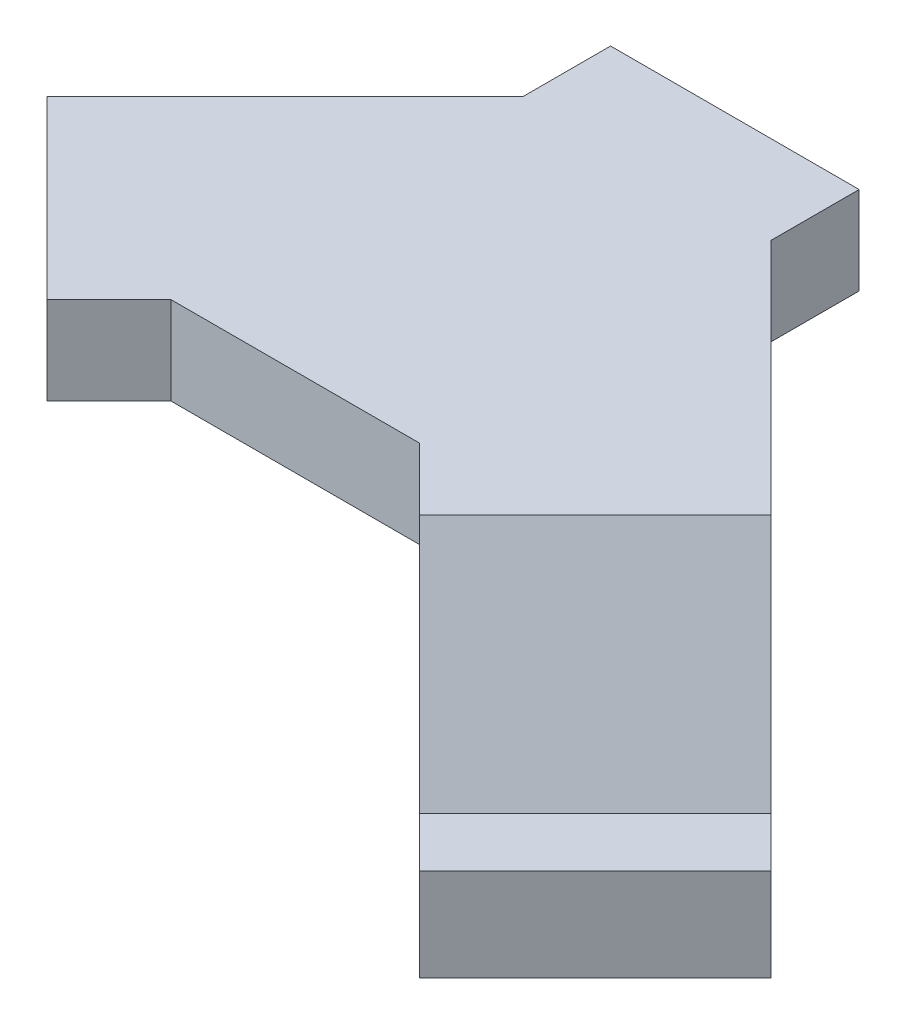
ISO-10303-21;
HEADER;
FILE_DESCRIPTION(('STEP AP214'),'2;1');
FILE_NAME('part.step','',(''),(''),'','','');
FILE_SCHEMA(('AUTOMOTIVE_DESIGN { 1 0 10303 214 1 1 1 1 }'));
ENDSEC;
DATA;
#1=APPLICATION_CONTEXT('core data for automotive mechanical design processes');
#2=APPLICATION_PROTOCOL_DEFINITION('international standard','automotive_design',2000,#1);
#3=PRODUCT_CONTEXT('',#1,'mechanical');
#4=PRODUCT('Part','Part','',(#3));
#5=PRODUCT_RELATED_PRODUCT_CATEGORY('part','',(#4));
#6=PRODUCT_DEFINITION_FORMATION('','',#4);
#7=PRODUCT_DEFINITION_CONTEXT('part definition',#1,'design');
#8=PRODUCT_DEFINITION('design','',#6,#7);
#9=PRODUCT_DEFINITION_SHAPE('','',#8);
#10=(LENGTH_UNIT() NAMED_UNIT(*) SI_UNIT(.MILLI.,.METRE.));
#11=(NAMED_UNIT(*) PLANE_ANGLE_UNIT() SI_UNIT($,.RADIAN.));
#12=(NAMED_UNIT(*) SI_UNIT($,.STERADIAN.) SOLID_ANGLE_UNIT());
#13=UNCERTAINTY_MEASURE_WITH_UNIT(LENGTH_MEASURE(1.E-05),#10,'distance_accuracy_value','');
#14=(GEOMETRIC_REPRESENTATION_CONTEXT(3) GLOBAL_UNCERTAINTY_ASSIGNED_CONTEXT((#13)) GLOBAL_UNIT_ASSIGNED_CONTEXT((#10,
#11,#12)) REPRESENTATION_CONTEXT('',''));
#15=CARTESIAN_POINT('',(0.,0.,0.));
#16=DIRECTION('',(0.,0.,1.));
#17=DIRECTION('',(1.,0.,0.));
#18=AXIS2_PLACEMENT_3D('',#15,#16,#17);
#19=CARTESIAN_POINT('',(-207.023919838023,5.,121.18782091253));
#20=DIRECTION('',(-0.707106781186548,0.,0.707106781186548));
#21=DIRECTION('',(0.707106781186548,0.,0.707106781186548));
#22=AXIS2_PLACEMENT_3D('',#19,#20,#21);
#23=PLANE('',#22);
#24=DIRECTION('',(-0.707106781186547,0.,-0.707106781186547));
#25=VECTOR('',#24,1.);
#26=CARTESIAN_POINT('',(-207.023919838023,0.,121.18782091253));
#27=LINE('',#26,#25);
#28=CARTESIAN_POINT('',(-203.488385932091,0.,124.723354818463));
#29=VERTEX_POINT('',#28);
#30=CARTESIAN_POINT('',(-217.023919838023,0.,111.18782091253));
#31=VERTEX_POINT('',#30);
#32=EDGE_CURVE('E79',#29,#31,#27,.T.);
#33=ORIENTED_EDGE('',*,*,#32,.T.);
#34=DIRECTION('',(0.,-1.,0.));
#35=VECTOR('',#34,1.);
#36=CARTESIAN_POINT('',(-217.023919838023,5.,111.18782091253));
#37=LINE('',#36,#35);
#38=CARTESIAN_POINT('',(-217.023919838023,5.,111.18782091253));
#39=VERTEX_POINT('',#38);
#40=EDGE_CURVE('E11',#39,#31,#37,.T.);
#41=ORIENTED_EDGE('',*,*,#40,.F.);
#42=DIRECTION('',(-0.707106781186547,0.,-0.707106781186547));
#43=VECTOR('',#42,1.);
#44=CARTESIAN_POINT('',(-207.023919838023,5.,121.18782091253));
#45=LINE('',#44,#43);
#46=CARTESIAN_POINT('',(-203.488385932091,5.,124.723354818463));
#47=VERTEX_POINT('',#46);
#48=EDGE_CURVE('E97',#47,#39,#45,.T.);
#49=ORIENTED_EDGE('',*,*,#48,.F.);
#50=DIRECTION('',(0.649640334699754,0.39488589625661,0.649640334699752));
#51=VECTOR('',#50,1.);
#52=CARTESIAN_POINT('',(-203.488385932091,5.,124.723354818463));
#53=LINE('',#52,#51);
#54=CARTESIAN_POINT('',(-160.887880868702,30.8948493872616,167.323859881852));
#55=VERTEX_POINT('',#54);
#56=EDGE_CURVE('E209',#47,#55,#53,.T.);
#57=ORIENTED_EDGE('',*,*,#56,.T.);
#58=DIRECTION('',(0.,1.,0.));
#59=VECTOR('',#58,1.);
#60=CARTESIAN_POINT('',(-160.887880868702,30.8948493872616,167.323859881852));
#61=LINE('',#60,#59);
#62=CARTESIAN_POINT('',(-160.887880868702,32.8948493872616,167.323859881852));
#63=VERTEX_POINT('',#62);
#64=EDGE_CURVE('E206',#55,#63,#61,.T.);
#65=ORIENTED_EDGE('',*,*,#64,.T.);
#66=DIRECTION('',(0.707106781186551,0.,0.707106781186544));
#67=VECTOR('',#66,1.);
#68=CARTESIAN_POINT('',(-160.887880868702,32.8948493872616,167.323859881852));
#69=LINE('',#68,#67);
#70=CARTESIAN_POINT('',(-158.059453743956,32.8948493872616,170.152287006598));
#71=VERTEX_POINT('',#70);
#72=EDGE_CURVE('E203',#63,#71,#69,.T.);
#73=ORIENTED_EDGE('',*,*,#72,.T.);
#74=DIRECTION('',(0.,-1.,0.));
#75=VECTOR('',#74,1.);
#76=CARTESIAN_POINT('',(-158.059453743956,32.8948493872616,170.152287006598));
#77=LINE('',#76,#75);
#78=CARTESIAN_POINT('',(-158.059453743956,27.6141176046023,170.152287006598));
#79=VERTEX_POINT('',#78);
#80=EDGE_CURVE('E200',#71,#79,#77,.T.);
#81=ORIENTED_EDGE('',*,*,#80,.T.);
#82=DIRECTION('',(-0.649640334699754,-0.394885896256609,-0.649640334699752));
#83=VECTOR('',#82,1.);
#84=CARTESIAN_POINT('',(-158.059453743956,27.6141176046023,170.152287006598));
#85=LINE('',#84,#83);
#86=EDGE_CURVE('E197',#79,#29,#85,.T.);
#87=ORIENTED_EDGE('',*,*,#86,.T.);
#88=EDGE_LOOP('',(#33,#41,#49,#57,#65,#73,#81,#87));
#89=FACE_BOUND('',#88,.T.);
#90=ADVANCED_FACE('F41',(#89),#23,.F.);
#91=CARTESIAN_POINT('',(-231.166055461754,5.,111.18782091253));
#92=DIRECTION('',(0.707106781186548,0.,0.707106781186548));
#93=DIRECTION('',(0.707106781186548,0.,-0.707106781186548));
#94=AXIS2_PLACEMENT_3D('',#91,#92,#93);
#95=PLANE('',#94);
#96=DIRECTION('',(-0.707106781186547,0.,0.707106781186547));
#97=VECTOR('',#96,1.);
#98=CARTESIAN_POINT('',(-231.166055461754,0.,111.18782091253));
#99=LINE('',#98,#97);
#100=CARTESIAN_POINT('',(-231.166055461754,0.,111.18782091253));
#101=VERTEX_POINT('',#100);
#102=CARTESIAN_POINT('',(-244.701589367687,0.,124.723354818463));
#103=VERTEX_POINT('',#102);
#104=EDGE_CURVE('E133',#101,#103,#99,.T.);
#105=ORIENTED_EDGE('',*,*,#104,.T.);
#106=DIRECTION('',(0.,1.,0.));
#107=VECTOR('',#106,1.);
#108=CARTESIAN_POINT('',(-244.701589367687,-19.142135623731,124.723354818463));
#109=LINE('',#108,#107);
#110=CARTESIAN_POINT('',(-244.701589367687,5.,124.723354818463));
#111=VERTEX_POINT('',#110);
#112=EDGE_CURVE('E93',#103,#111,#109,.T.);
#113=ORIENTED_EDGE('',*,*,#112,.T.);
#114=DIRECTION('',(-0.707106781186547,0.,0.707106781186547));
#115=VECTOR('',#114,1.);
#116=CARTESIAN_POINT('',(-231.166055461754,5.,111.18782091253));
#117=LINE('',#116,#115);
#118=CARTESIAN_POINT('',(-231.166055461754,5.,111.18782091253));
#119=VERTEX_POINT('',#118);
#120=EDGE_CURVE('E89',#119,#111,#117,.T.);
#121=ORIENTED_EDGE('',*,*,#120,.F.);
#122=DIRECTION('',(0.,-1.,0.));
#123=VECTOR('',#122,1.);
#124=CARTESIAN_POINT('',(-231.166055461754,5.,111.18782091253));
#125=LINE('',#124,#123);
#126=EDGE_CURVE('E49',#119,#101,#125,.T.);
#127=ORIENTED_EDGE('',*,*,#126,.T.);
#128=EDGE_LOOP('',(#105,#113,#121,#127));
#129=FACE_BOUND('',#128,.T.);
#130=ADVANCED_FACE('F90',(#129),#95,.F.);
#131=CARTESIAN_POINT('',(-231.166055461754,5.,131.18782091253));
#132=DIRECTION('',(0.,0.,-1.));
#133=DIRECTION('',(-1.,0.,0.));
#134=AXIS2_PLACEMENT_3D('',#131,#132,#133);
#135=PLANE('',#134);
#136=DIRECTION('',(1.,0.,0.));
#137=VECTOR('',#136,1.);
#138=CARTESIAN_POINT('',(-231.166055461754,0.,131.18782091253));
#139=LINE('',#138,#137);
#140=CARTESIAN_POINT('',(-231.166055461754,0.,131.18782091253));
#141=VERTEX_POINT('',#140);
#142=CARTESIAN_POINT('',(-217.023919838023,0.,131.18782091253));
#143=VERTEX_POINT('',#142);
#144=EDGE_CURVE('E128',#141,#143,#139,.T.);
#145=ORIENTED_EDGE('',*,*,#144,.T.);
#146=DIRECTION('',(0.,-1.,0.));
#147=VECTOR('',#146,1.);
#148=CARTESIAN_POINT('',(-217.023919838023,5.,131.18782091253));
#149=LINE('',#148,#147);
#150=CARTESIAN_POINT('',(-217.023919838023,5.,131.18782091253));
#151=VERTEX_POINT('',#150);
#152=EDGE_CURVE('E131',#151,#143,#149,.T.);
#153=ORIENTED_EDGE('',*,*,#152,.F.);
#154=DIRECTION('',(1.,0.,0.));
#155=VECTOR('',#154,1.);
#156=CARTESIAN_POINT('',(-231.166055461754,5.,131.18782091253));
#157=LINE('',#156,#155);
#158=CARTESIAN_POINT('',(-231.166055461754,5.,131.18782091253));
#159=VERTEX_POINT('',#158);
#160=EDGE_CURVE('E57',#159,#151,#157,.T.);
#161=ORIENTED_EDGE('',*,*,#160,.F.);
#162=DIRECTION('',(0.,-1.,0.));
#163=VECTOR('',#162,1.);
#164=CARTESIAN_POINT('',(-231.166055461754,5.,131.18782091253));
#165=LINE('',#164,#163);
#166=EDGE_CURVE('E109',#159,#141,#165,.T.);
#167=ORIENTED_EDGE('',*,*,#166,.T.);
#168=EDGE_LOOP('',(#145,#153,#161,#167));
#169=FACE_BOUND('',#168,.T.);
#170=ADVANCED_FACE('F143',(#169),#135,.F.);
#171=CARTESIAN_POINT('',(0.,5.,0.));
#172=DIRECTION('',(0.,1.,0.));
#173=DIRECTION('',(0.,0.,1.));
#174=AXIS2_PLACEMENT_3D('',#171,#172,#173);
#175=PLANE('',#174);
#176=ORIENTED_EDGE('',*,*,#160,.T.);
#177=DIRECTION('',(0.707106781186547,0.,0.707106781186547));
#178=VECTOR('',#177,1.);
#179=CARTESIAN_POINT('',(-217.023919838023,5.,131.18782091253));
#180=LINE('',#179,#178);
#181=CARTESIAN_POINT('',(-213.488385932091,5.,134.723354818463));
#182=VERTEX_POINT('',#181);
#183=EDGE_CURVE('E161',#151,#182,#180,.T.);
#184=ORIENTED_EDGE('',*,*,#183,.T.);
#185=DIRECTION('',(0.707106781186549,0.,-0.707106781186547));
#186=VECTOR('',#185,1.);
#187=CARTESIAN_POINT('',(-213.488385932091,5.,134.723354818463));
#188=LINE('',#187,#186);
#189=EDGE_CURVE('E164',#182,#47,#188,.T.);
#190=ORIENTED_EDGE('',*,*,#189,.T.);
#191=ORIENTED_EDGE('',*,*,#48,.T.);
#192=DIRECTION('',(0.,0.,-1.));
#193=VECTOR('',#192,1.);
#194=CARTESIAN_POINT('',(-217.023919838023,5.,106.18782091253));
#195=LINE('',#194,#193);
#196=CARTESIAN_POINT('',(-217.023919838023,5.,106.18782091253));
#197=VERTEX_POINT('',#196);
#198=EDGE_CURVE('E119',#39,#197,#195,.T.);
#199=ORIENTED_EDGE('',*,*,#198,.T.);
#200=DIRECTION('',(-1.,0.,0.));
#201=VECTOR('',#200,1.);
#202=CARTESIAN_POINT('',(-231.166055461754,5.,106.18782091253));
#203=LINE('',#202,#201);
#204=CARTESIAN_POINT('',(-231.166055461754,5.,106.18782091253));
#205=VERTEX_POINT('',#204);
#206=EDGE_CURVE('E113',#197,#205,#203,.T.);
#207=ORIENTED_EDGE('',*,*,#206,.T.);
#208=DIRECTION('',(0.,0.,1.));
#209=VECTOR('',#208,1.);
#210=CARTESIAN_POINT('',(-231.166055461754,5.,106.18782091253));
#211=LINE('',#210,#209);
#212=EDGE_CURVE('E105',#205,#119,#211,.T.);
#213=ORIENTED_EDGE('',*,*,#212,.T.);
#214=ORIENTED_EDGE('',*,*,#120,.T.);
#215=DIRECTION('',(0.707106781186547,0.,0.707106781186547));
#216=VECTOR('',#215,1.);
#217=CARTESIAN_POINT('',(-234.701589367687,5.,134.723354818463));
#218=LINE('',#217,#216);
#219=CARTESIAN_POINT('',(-234.701589367687,5.,134.723354818463));
#220=VERTEX_POINT('',#219);
#221=EDGE_CURVE('E173',#111,#220,#218,.T.);
#222=ORIENTED_EDGE('',*,*,#221,.T.);
#223=DIRECTION('',(0.707106781186545,0.,-0.70710678118655));
#224=VECTOR('',#223,1.);
#225=CARTESIAN_POINT('',(-231.166055461754,5.,131.18782091253));
#226=LINE('',#225,#224);
#227=EDGE_CURVE('E167',#220,#159,#226,.T.);
#228=ORIENTED_EDGE('',*,*,#227,.T.);
#229=EDGE_LOOP('',(#176,#184,#190,#191,#199,#207,#213,#214,#222,#228));
#230=FACE_BOUND('',#229,.T.);
#231=ADVANCED_FACE('F110',(#230),#175,.T.);
#232=CARTESIAN_POINT('',(0.,0.,0.));
#233=DIRECTION('',(0.,1.,0.));
#234=DIRECTION('',(0.,0.,1.));
#235=AXIS2_PLACEMENT_3D('',#232,#233,#234);
#236=PLANE('',#235);
#237=ORIENTED_EDGE('',*,*,#32,.F.);
#238=DIRECTION('',(-0.707106781186549,0.,0.707106781186547));
#239=VECTOR('',#238,1.);
#240=CARTESIAN_POINT('',(-213.488385932091,0.,134.723354818463));
#241=LINE('',#240,#239);
#242=CARTESIAN_POINT('',(-213.488385932091,0.,134.723354818463));
#243=VERTEX_POINT('',#242);
#244=EDGE_CURVE('E178',#29,#243,#241,.T.);
#245=ORIENTED_EDGE('',*,*,#244,.T.);
#246=DIRECTION('',(-0.707106781186548,0.,-0.707106781186548));
#247=VECTOR('',#246,1.);
#248=CARTESIAN_POINT('',(-217.023919838023,0.,131.18782091253));
#249=LINE('',#248,#247);
#250=EDGE_CURVE('E177',#243,#143,#249,.T.);
#251=ORIENTED_EDGE('',*,*,#250,.T.);
#252=ORIENTED_EDGE('',*,*,#144,.F.);
#253=DIRECTION('',(-0.707106781186545,0.,0.70710678118655));
#254=VECTOR('',#253,1.);
#255=CARTESIAN_POINT('',(-231.166055461754,0.,131.18782091253));
#256=LINE('',#255,#254);
#257=CARTESIAN_POINT('',(-234.701589367687,0.,134.723354818463));
#258=VERTEX_POINT('',#257);
#259=EDGE_CURVE('E153',#141,#258,#256,.T.);
#260=ORIENTED_EDGE('',*,*,#259,.T.);
#261=DIRECTION('',(-0.707106781186548,0.,-0.707106781186548));
#262=VECTOR('',#261,1.);
#263=CARTESIAN_POINT('',(-234.701589367687,0.,134.723354818463));
#264=LINE('',#263,#262);
#265=EDGE_CURVE('E160',#258,#103,#264,.T.);
#266=ORIENTED_EDGE('',*,*,#265,.T.);
#267=ORIENTED_EDGE('',*,*,#104,.F.);
#268=DIRECTION('',(0.,0.,-1.));
#269=VECTOR('',#268,1.);
#270=CARTESIAN_POINT('',(-231.166055461754,0.,106.18782091253));
#271=LINE('',#270,#269);
#272=CARTESIAN_POINT('',(-231.166055461754,0.,106.18782091253));
#273=VERTEX_POINT('',#272);
#274=EDGE_CURVE('E108',#101,#273,#271,.T.);
#275=ORIENTED_EDGE('',*,*,#274,.T.);
#276=DIRECTION('',(1.,0.,0.));
#277=VECTOR('',#276,1.);
#278=CARTESIAN_POINT('',(-231.166055461754,0.,106.18782091253));
#279=LINE('',#278,#277);
#280=CARTESIAN_POINT('',(-217.023919838023,0.,106.18782091253));
#281=VERTEX_POINT('',#280);
#282=EDGE_CURVE('E125',#273,#281,#279,.T.);
#283=ORIENTED_EDGE('',*,*,#282,.T.);
#284=DIRECTION('',(0.,0.,1.));
#285=VECTOR('',#284,1.);
#286=CARTESIAN_POINT('',(-217.023919838023,0.,106.18782091253));
#287=LINE('',#286,#285);
#288=EDGE_CURVE('E127',#281,#31,#287,.T.);
#289=ORIENTED_EDGE('',*,*,#288,.T.);
#290=EDGE_LOOP('',(#237,#245,#251,#252,#260,#266,#267,#275,#283,#289));
#291=FACE_BOUND('',#290,.T.);
#292=ADVANCED_FACE('F256',(#291),#236,.F.);
#293=CARTESIAN_POINT('',(-217.023919838023,-19.142135623731,106.18782091253));
#294=DIRECTION('',(1.,0.,0.));
#295=DIRECTION('',(0.,0.,-1.));
#296=AXIS2_PLACEMENT_3D('',#293,#294,#295);
#297=PLANE('',#296);
#298=ORIENTED_EDGE('',*,*,#288,.F.);
#299=DIRECTION('',(0.,1.,0.));
#300=VECTOR('',#299,1.);
#301=CARTESIAN_POINT('',(-217.023919838023,-19.142135623731,106.18782091253));
#302=LINE('',#301,#300);
#303=EDGE_CURVE('E114',#281,#197,#302,.T.);
#304=ORIENTED_EDGE('',*,*,#303,.T.);
#305=ORIENTED_EDGE('',*,*,#198,.F.);
#306=ORIENTED_EDGE('',*,*,#40,.T.);
#307=EDGE_LOOP('',(#298,#304,#305,#306));
#308=FACE_BOUND('',#307,.T.);
#309=ADVANCED_FACE('F263',(#308),#297,.T.);
#310=CARTESIAN_POINT('',(-231.166055461754,-19.142135623731,106.18782091253));
#311=DIRECTION('',(-1.,0.,0.));
#312=DIRECTION('',(0.,0.,1.));
#313=AXIS2_PLACEMENT_3D('',#310,#311,#312);
#314=PLANE('',#313);
#315=ORIENTED_EDGE('',*,*,#274,.F.);
#316=ORIENTED_EDGE('',*,*,#126,.F.);
#317=ORIENTED_EDGE('',*,*,#212,.F.);
#318=DIRECTION('',(0.,1.,0.));
#319=VECTOR('',#318,1.);
#320=CARTESIAN_POINT('',(-231.166055461754,-19.142135623731,106.18782091253));
#321=LINE('',#320,#319);
#322=EDGE_CURVE('E117',#273,#205,#321,.T.);
#323=ORIENTED_EDGE('',*,*,#322,.F.);
#324=EDGE_LOOP('',(#315,#316,#317,#323));
#325=FACE_BOUND('',#324,.T.);
#326=ADVANCED_FACE('F102',(#325),#314,.T.);
#327=CARTESIAN_POINT('',(-231.166055461754,-19.142135623731,106.18782091253));
#328=DIRECTION('',(0.,0.,-1.));
#329=DIRECTION('',(-1.,0.,0.));
#330=AXIS2_PLACEMENT_3D('',#327,#328,#329);
#331=PLANE('',#330);
#332=ORIENTED_EDGE('',*,*,#282,.F.);
#333=ORIENTED_EDGE('',*,*,#322,.T.);
#334=ORIENTED_EDGE('',*,*,#206,.F.);
#335=ORIENTED_EDGE('',*,*,#303,.F.);
#336=EDGE_LOOP('',(#332,#333,#334,#335));
#337=FACE_BOUND('',#336,.T.);
#338=ADVANCED_FACE('F261',(#337),#331,.T.);
#339=CARTESIAN_POINT('',(-231.166055461754,-19.142135623731,131.18782091253));
#340=DIRECTION('',(0.70710678118655,0.,0.707106781186545));
#341=DIRECTION('',(0.707106781186545,0.,-0.70710678118655));
#342=AXIS2_PLACEMENT_3D('',#339,#340,#341);
#343=PLANE('',#342);
#344=ORIENTED_EDGE('',*,*,#259,.F.);
#345=ORIENTED_EDGE('',*,*,#166,.F.);
#346=ORIENTED_EDGE('',*,*,#227,.F.);
#347=DIRECTION('',(0.,1.,0.));
#348=VECTOR('',#347,1.);
#349=CARTESIAN_POINT('',(-234.701589367687,-19.142135623731,134.723354818463));
#350=LINE('',#349,#348);
#351=EDGE_CURVE('E156',#258,#220,#350,.T.);
#352=ORIENTED_EDGE('',*,*,#351,.F.);
#353=EDGE_LOOP('',(#344,#345,#346,#352));
#354=FACE_BOUND('',#353,.T.);
#355=ADVANCED_FACE('F154',(#354),#343,.T.);
#356=CARTESIAN_POINT('',(-234.701589367687,-19.142135623731,134.723354818463));
#357=DIRECTION('',(-0.707106781186548,0.,0.707106781186548));
#358=DIRECTION('',(0.707106781186548,0.,0.707106781186548));
#359=AXIS2_PLACEMENT_3D('',#356,#357,#358);
#360=PLANE('',#359);
#361=ORIENTED_EDGE('',*,*,#265,.F.);
#362=ORIENTED_EDGE('',*,*,#351,.T.);
#363=ORIENTED_EDGE('',*,*,#221,.F.);
#364=ORIENTED_EDGE('',*,*,#112,.F.);
#365=EDGE_LOOP('',(#361,#362,#363,#364));
#366=FACE_BOUND('',#365,.T.);
#367=ADVANCED_FACE('F311',(#366),#360,.T.);
#368=CARTESIAN_POINT('',(-217.023919838023,-19.142135623731,131.18782091253));
#369=DIRECTION('',(-0.707106781186548,0.,0.707106781186548));
#370=DIRECTION('',(0.707106781186548,0.,0.707106781186548));
#371=AXIS2_PLACEMENT_3D('',#368,#369,#370);
#372=PLANE('',#371);
#373=ORIENTED_EDGE('',*,*,#250,.F.);
#374=DIRECTION('',(-0.649640334699754,-0.394885896256609,-0.649640334699752));
#375=VECTOR('',#374,1.);
#376=CARTESIAN_POINT('',(-168.059453743956,27.6141176046023,180.152287006598));
#377=LINE('',#376,#375);
#378=CARTESIAN_POINT('',(-168.059453743956,27.6141176046023,180.152287006598));
#379=VERTEX_POINT('',#378);
#380=EDGE_CURVE('E189',#379,#243,#377,.T.);
#381=ORIENTED_EDGE('',*,*,#380,.F.);
#382=DIRECTION('',(0.,-1.,0.));
#383=VECTOR('',#382,1.);
#384=CARTESIAN_POINT('',(-168.059453743956,32.8948493872616,180.152287006598));
#385=LINE('',#384,#383);
#386=CARTESIAN_POINT('',(-168.059453743956,32.8948493872616,180.152287006598));
#387=VERTEX_POINT('',#386);
#388=EDGE_CURVE('E214',#387,#379,#385,.T.);
#389=ORIENTED_EDGE('',*,*,#388,.F.);
#390=DIRECTION('',(0.707106781186551,0.,0.707106781186544));
#391=VECTOR('',#390,1.);
#392=CARTESIAN_POINT('',(-170.887880868702,32.8948493872616,177.323859881852));
#393=LINE('',#392,#391);
#394=CARTESIAN_POINT('',(-170.887880868702,32.8948493872616,177.323859881852));
#395=VERTEX_POINT('',#394);
#396=EDGE_CURVE('E217',#395,#387,#393,.T.);
#397=ORIENTED_EDGE('',*,*,#396,.F.);
#398=DIRECTION('',(0.,1.,0.));
#399=VECTOR('',#398,1.);
#400=CARTESIAN_POINT('',(-170.887880868702,30.8948493872616,177.323859881852));
#401=LINE('',#400,#399);
#402=CARTESIAN_POINT('',(-170.887880868702,30.8948493872616,177.323859881852));
#403=VERTEX_POINT('',#402);
#404=EDGE_CURVE('E220',#403,#395,#401,.T.);
#405=ORIENTED_EDGE('',*,*,#404,.F.);
#406=DIRECTION('',(0.649640334699754,0.39488589625661,0.649640334699752));
#407=VECTOR('',#406,1.);
#408=CARTESIAN_POINT('',(-213.488385932091,5.,134.723354818463));
#409=LINE('',#408,#407);
#410=EDGE_CURVE('E199',#182,#403,#409,.T.);
#411=ORIENTED_EDGE('',*,*,#410,.F.);
#412=ORIENTED_EDGE('',*,*,#183,.F.);
#413=ORIENTED_EDGE('',*,*,#152,.T.);
#414=EDGE_LOOP('',(#373,#381,#389,#397,#405,#411,#412,#413));
#415=FACE_BOUND('',#414,.T.);
#416=ADVANCED_FACE('F241',(#415),#372,.T.);
#417=CARTESIAN_POINT('',(-168.059453743956,27.6141176046023,180.152287006598));
#418=DIRECTION('',(0.279226495037976,-0.918730171996988,0.279226495037976));
#419=DIRECTION('',(0.956786082423652,0.290792696745295,0.));
#420=AXIS2_PLACEMENT_3D('',#417,#418,#419);
#421=PLANE('',#420);
#422=ORIENTED_EDGE('',*,*,#86,.F.);
#423=DIRECTION('',(0.707106781186547,0.,-0.707106781186548));
#424=VECTOR('',#423,1.);
#425=CARTESIAN_POINT('',(-168.059453743956,27.6141176046023,180.152287006598));
#426=LINE('',#425,#424);
#427=EDGE_CURVE('E184',#379,#79,#426,.T.);
#428=ORIENTED_EDGE('',*,*,#427,.F.);
#429=ORIENTED_EDGE('',*,*,#380,.T.);
#430=ORIENTED_EDGE('',*,*,#244,.F.);
#431=EDGE_LOOP('',(#422,#428,#429,#430));
#432=FACE_BOUND('',#431,.T.);
#433=ADVANCED_FACE('F319',(#432),#421,.T.);
#434=CARTESIAN_POINT('',(-168.059453743956,32.8948493872616,180.152287006598));
#435=DIRECTION('',(0.707106781186548,0.,0.707106781186547));
#436=DIRECTION('',(0.707106781186547,0.,-0.707106781186548));
#437=AXIS2_PLACEMENT_3D('',#434,#435,#436);
#438=PLANE('',#437);
#439=ORIENTED_EDGE('',*,*,#80,.F.);
#440=DIRECTION('',(0.707106781186547,0.,-0.707106781186548));
#441=VECTOR('',#440,1.);
#442=CARTESIAN_POINT('',(-168.059453743956,32.8948493872616,180.152287006598));
#443=LINE('',#442,#441);
#444=EDGE_CURVE('E192',#387,#71,#443,.T.);
#445=ORIENTED_EDGE('',*,*,#444,.F.);
#446=ORIENTED_EDGE('',*,*,#388,.T.);
#447=ORIENTED_EDGE('',*,*,#427,.T.);
#448=EDGE_LOOP('',(#439,#445,#446,#447));
#449=FACE_BOUND('',#448,.T.);
#450=ADVANCED_FACE('F326',(#449),#438,.T.);
#451=CARTESIAN_POINT('',(-170.887880868702,32.8948493872616,177.323859881852));
#452=DIRECTION('',(0.,1.,0.));
#453=DIRECTION('',(0.,0.,1.));
#454=AXIS2_PLACEMENT_3D('',#451,#452,#453);
#455=PLANE('',#454);
#456=ORIENTED_EDGE('',*,*,#72,.F.);
#457=DIRECTION('',(0.707106781186547,0.,-0.707106781186548));
#458=VECTOR('',#457,1.);
#459=CARTESIAN_POINT('',(-170.887880868702,32.8948493872616,177.323859881852));
#460=LINE('',#459,#458);
#461=EDGE_CURVE('E188',#395,#63,#460,.T.);
#462=ORIENTED_EDGE('',*,*,#461,.F.);
#463=ORIENTED_EDGE('',*,*,#396,.T.);
#464=ORIENTED_EDGE('',*,*,#444,.T.);
#465=EDGE_LOOP('',(#456,#462,#463,#464));
#466=FACE_BOUND('',#465,.T.);
#467=ADVANCED_FACE('F286',(#466),#455,.T.);
#468=CARTESIAN_POINT('',(-170.887880868702,30.8948493872616,177.323859881852));
#469=DIRECTION('',(-0.707106781186548,0.,-0.707106781186547));
#470=DIRECTION('',(-0.707106781186547,0.,0.707106781186548));
#471=AXIS2_PLACEMENT_3D('',#468,#469,#470);
#472=PLANE('',#471);
#473=ORIENTED_EDGE('',*,*,#64,.F.);
#474=DIRECTION('',(0.707106781186547,0.,-0.707106781186548));
#475=VECTOR('',#474,1.);
#476=CARTESIAN_POINT('',(-170.887880868702,30.8948493872616,177.323859881852));
#477=LINE('',#476,#475);
#478=EDGE_CURVE('E185',#403,#55,#477,.T.);
#479=ORIENTED_EDGE('',*,*,#478,.F.);
#480=ORIENTED_EDGE('',*,*,#404,.T.);
#481=ORIENTED_EDGE('',*,*,#461,.T.);
#482=EDGE_LOOP('',(#473,#479,#480,#481));
#483=FACE_BOUND('',#482,.T.);
#484=ADVANCED_FACE('F290',(#483),#472,.T.);
#485=CARTESIAN_POINT('',(-213.488385932091,5.,134.723354818463));
#486=DIRECTION('',(-0.279226495037976,0.918730171996987,-0.279226495037976));
#487=DIRECTION('',(-0.956786082423652,-0.290792696745295,0.));
#488=AXIS2_PLACEMENT_3D('',#485,#486,#487);
#489=PLANE('',#488);
#490=ORIENTED_EDGE('',*,*,#56,.F.);
#491=ORIENTED_EDGE('',*,*,#189,.F.);
#492=ORIENTED_EDGE('',*,*,#410,.T.);
#493=ORIENTED_EDGE('',*,*,#478,.T.);
#494=EDGE_LOOP('',(#490,#491,#492,#493));
#495=FACE_BOUND('',#494,.T.);
#496=ADVANCED_FACE('F229',(#495),#489,.T.);
#497=CLOSED_SHELL('',(#90,#130,#170,#231,#292,#309,#326,#338,#355,#367,#416,#433,#450,#467,#484,#496));
#498=MANIFOLD_SOLID_BREP('B2',#497);
#499=ADVANCED_BREP_SHAPE_REPRESENTATION('',(#18,#498),#14);
#500=SHAPE_DEFINITION_REPRESENTATION(#9,#499);
ENDSEC;
END-ISO-10303-21;
